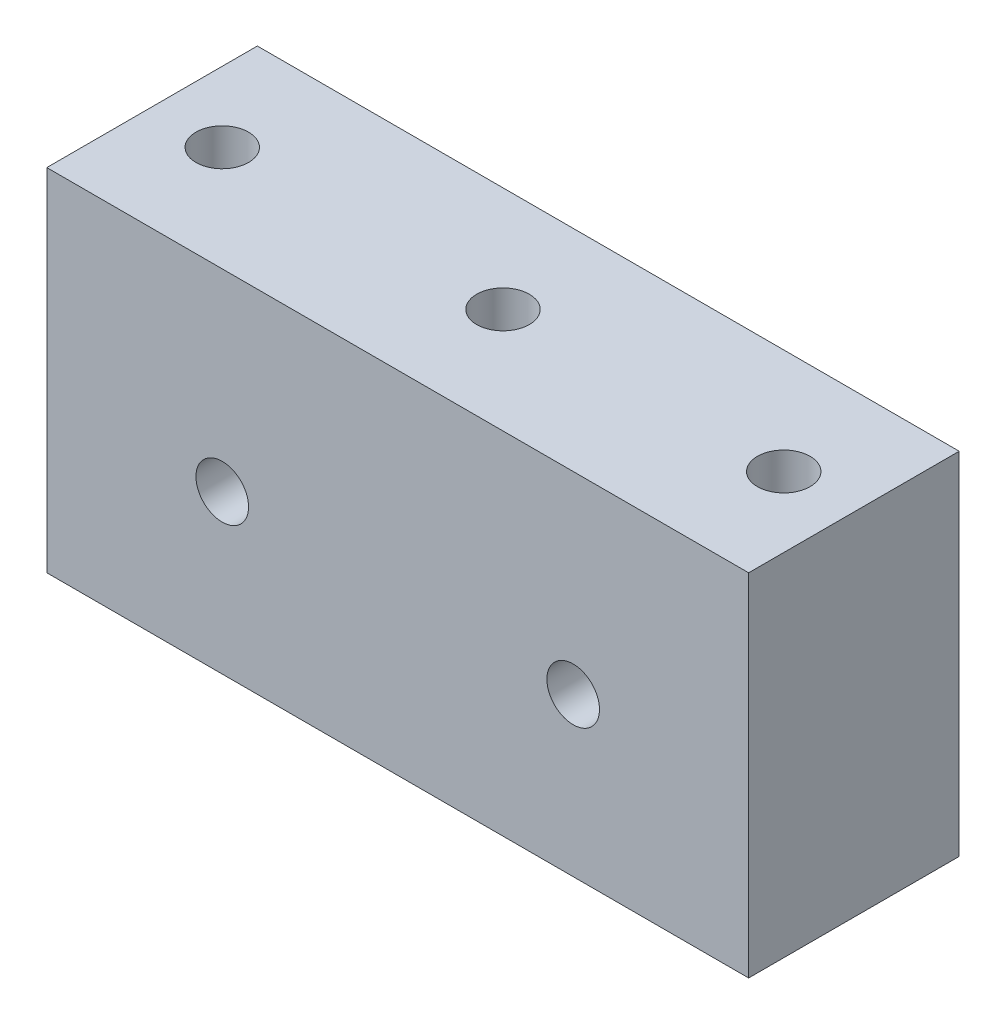
ISO-10303-21;
HEADER;
FILE_DESCRIPTION(('STEP AP214'),'2;1');
FILE_NAME('part.step','',(''),(''),'','','');
FILE_SCHEMA(('AUTOMOTIVE_DESIGN { 1 0 10303 214 1 1 1 1 }'));
ENDSEC;
DATA;
#1=APPLICATION_CONTEXT('core data for automotive mechanical design processes');
#2=APPLICATION_PROTOCOL_DEFINITION('international standard','automotive_design',2000,#1);
#3=PRODUCT_CONTEXT('',#1,'mechanical');
#4=PRODUCT('Part','Part','',(#3));
#5=PRODUCT_RELATED_PRODUCT_CATEGORY('part','',(#4));
#6=PRODUCT_DEFINITION_FORMATION('','',#4);
#7=PRODUCT_DEFINITION_CONTEXT('part definition',#1,'design');
#8=PRODUCT_DEFINITION('design','',#6,#7);
#9=PRODUCT_DEFINITION_SHAPE('','',#8);
#10=(LENGTH_UNIT() NAMED_UNIT(*) SI_UNIT(.MILLI.,.METRE.));
#11=(NAMED_UNIT(*) PLANE_ANGLE_UNIT() SI_UNIT($,.RADIAN.));
#12=(NAMED_UNIT(*) SI_UNIT($,.STERADIAN.) SOLID_ANGLE_UNIT());
#13=UNCERTAINTY_MEASURE_WITH_UNIT(LENGTH_MEASURE(1.E-05),#10,'distance_accuracy_value','');
#14=(GEOMETRIC_REPRESENTATION_CONTEXT(3) GLOBAL_UNCERTAINTY_ASSIGNED_CONTEXT((#13)) GLOBAL_UNIT_ASSIGNED_CONTEXT((#10,
#11,#12)) REPRESENTATION_CONTEXT('',''));
#15=CARTESIAN_POINT('',(0.,0.,0.));
#16=DIRECTION('',(0.,0.,1.));
#17=DIRECTION('',(1.,0.,0.));
#18=AXIS2_PLACEMENT_3D('',#15,#16,#17);
#19=CARTESIAN_POINT('',(0.,20.,0.));
#20=DIRECTION('',(0.,1.,0.));
#21=DIRECTION('',(0.,0.,1.));
#22=AXIS2_PLACEMENT_3D('',#19,#20,#21);
#23=PLANE('',#22);
#24=CARTESIAN_POINT('',(-16.,20.,0.));
#25=DIRECTION('',(0.,1.,0.));
#26=DIRECTION('',(0.,0.,1.));
#27=AXIS2_PLACEMENT_3D('',#24,#25,#26);
#28=CIRCLE('',#27,1.5);
#29=CARTESIAN_POINT('',(-16.,20.,1.5));
#30=VERTEX_POINT('',#29);
#31=EDGE_CURVE('E135',#30,#30,#28,.T.);
#32=ORIENTED_EDGE('',*,*,#31,.F.);
#33=EDGE_LOOP('',(#32));
#34=FACE_BOUND('',#33,.T.);
#35=DIRECTION('',(0.,0.,-1.));
#36=VECTOR('',#35,1.);
#37=CARTESIAN_POINT('',(20.,20.,-6.));
#38=LINE('',#37,#36);
#39=CARTESIAN_POINT('',(20.,20.,6.));
#40=VERTEX_POINT('',#39);
#41=CARTESIAN_POINT('',(20.,20.,-6.));
#42=VERTEX_POINT('',#41);
#43=EDGE_CURVE('E93',#40,#42,#38,.T.);
#44=ORIENTED_EDGE('',*,*,#43,.T.);
#45=DIRECTION('',(-1.,0.,0.));
#46=VECTOR('',#45,1.);
#47=CARTESIAN_POINT('',(-20.,20.,-6.));
#48=LINE('',#47,#46);
#49=CARTESIAN_POINT('',(-20.,20.,-6.));
#50=VERTEX_POINT('',#49);
#51=EDGE_CURVE('E88',#42,#50,#48,.T.);
#52=ORIENTED_EDGE('',*,*,#51,.T.);
#53=DIRECTION('',(0.,0.,1.));
#54=VECTOR('',#53,1.);
#55=CARTESIAN_POINT('',(-20.,20.,-6.));
#56=LINE('',#55,#54);
#57=CARTESIAN_POINT('',(-20.,20.,6.));
#58=VERTEX_POINT('',#57);
#59=EDGE_CURVE('E91',#50,#58,#56,.T.);
#60=ORIENTED_EDGE('',*,*,#59,.T.);
#61=DIRECTION('',(1.,0.,0.));
#62=VECTOR('',#61,1.);
#63=CARTESIAN_POINT('',(-20.,20.,6.));
#64=LINE('',#63,#62);
#65=EDGE_CURVE('E58',#58,#40,#64,.T.);
#66=ORIENTED_EDGE('',*,*,#65,.T.);
#67=EDGE_LOOP('',(#44,#52,#60,#66));
#68=FACE_BOUND('',#67,.T.);
#69=CARTESIAN_POINT('',(0.,20.,0.));
#70=DIRECTION('',(0.,1.,0.));
#71=DIRECTION('',(0.,0.,1.));
#72=AXIS2_PLACEMENT_3D('',#69,#70,#71);
#73=CIRCLE('',#72,1.5);
#74=CARTESIAN_POINT('',(0.,20.,1.5));
#75=VERTEX_POINT('',#74);
#76=EDGE_CURVE('E109',#75,#75,#73,.T.);
#77=ORIENTED_EDGE('',*,*,#76,.F.);
#78=EDGE_LOOP('',(#77));
#79=FACE_BOUND('',#78,.T.);
#80=CARTESIAN_POINT('',(16.,20.,0.));
#81=DIRECTION('',(0.,1.,0.));
#82=DIRECTION('',(0.,0.,-1.));
#83=AXIS2_PLACEMENT_3D('',#80,#81,#82);
#84=CIRCLE('',#83,1.5);
#85=CARTESIAN_POINT('',(16.,20.,-1.5));
#86=VERTEX_POINT('',#85);
#87=EDGE_CURVE('E129',#86,#86,#84,.T.);
#88=ORIENTED_EDGE('',*,*,#87,.F.);
#89=EDGE_LOOP('',(#88));
#90=FACE_BOUND('',#89,.T.);
#91=ADVANCED_FACE('F39',(#34,#68,#79,#90),#23,.T.);
#92=CARTESIAN_POINT('',(0.,0.,0.));
#93=DIRECTION('',(0.,1.,0.));
#94=DIRECTION('',(0.,0.,1.));
#95=AXIS2_PLACEMENT_3D('',#92,#93,#94);
#96=PLANE('',#95);
#97=DIRECTION('',(0.,0.,-1.));
#98=VECTOR('',#97,1.);
#99=CARTESIAN_POINT('',(20.,0.,-6.));
#100=LINE('',#99,#98);
#101=CARTESIAN_POINT('',(20.,0.,6.));
#102=VERTEX_POINT('',#101);
#103=CARTESIAN_POINT('',(20.,0.,-6.));
#104=VERTEX_POINT('',#103);
#105=EDGE_CURVE('E106',#102,#104,#100,.T.);
#106=ORIENTED_EDGE('',*,*,#105,.F.);
#107=DIRECTION('',(1.,0.,0.));
#108=VECTOR('',#107,1.);
#109=CARTESIAN_POINT('',(-20.,0.,6.));
#110=LINE('',#109,#108);
#111=CARTESIAN_POINT('',(-20.,0.,6.));
#112=VERTEX_POINT('',#111);
#113=EDGE_CURVE('E81',#112,#102,#110,.T.);
#114=ORIENTED_EDGE('',*,*,#113,.F.);
#115=DIRECTION('',(0.,0.,1.));
#116=VECTOR('',#115,1.);
#117=CARTESIAN_POINT('',(-20.,0.,-6.));
#118=LINE('',#117,#116);
#119=CARTESIAN_POINT('',(-20.,0.,-6.));
#120=VERTEX_POINT('',#119);
#121=EDGE_CURVE('E75',#120,#112,#118,.T.);
#122=ORIENTED_EDGE('',*,*,#121,.F.);
#123=DIRECTION('',(-1.,0.,0.));
#124=VECTOR('',#123,1.);
#125=CARTESIAN_POINT('',(-20.,0.,-6.));
#126=LINE('',#125,#124);
#127=EDGE_CURVE('E97',#104,#120,#126,.T.);
#128=ORIENTED_EDGE('',*,*,#127,.F.);
#129=EDGE_LOOP('',(#106,#114,#122,#128));
#130=FACE_BOUND('',#129,.T.);
#131=CARTESIAN_POINT('',(0.,0.,0.));
#132=DIRECTION('',(0.,1.,0.));
#133=DIRECTION('',(0.,0.,1.));
#134=AXIS2_PLACEMENT_3D('',#131,#132,#133);
#135=CIRCLE('',#134,1.5);
#136=CARTESIAN_POINT('',(0.,0.,1.5));
#137=VERTEX_POINT('',#136);
#138=EDGE_CURVE('E138',#137,#137,#135,.T.);
#139=ORIENTED_EDGE('',*,*,#138,.T.);
#140=EDGE_LOOP('',(#139));
#141=FACE_BOUND('',#140,.T.);
#142=CARTESIAN_POINT('',(-16.,0.,0.));
#143=DIRECTION('',(0.,1.,0.));
#144=DIRECTION('',(0.,0.,1.));
#145=AXIS2_PLACEMENT_3D('',#142,#143,#144);
#146=CIRCLE('',#145,1.5);
#147=CARTESIAN_POINT('',(-16.,0.,1.5));
#148=VERTEX_POINT('',#147);
#149=EDGE_CURVE('E132',#148,#148,#146,.T.);
#150=ORIENTED_EDGE('',*,*,#149,.T.);
#151=EDGE_LOOP('',(#150));
#152=FACE_BOUND('',#151,.T.);
#153=CARTESIAN_POINT('',(16.,0.,0.));
#154=DIRECTION('',(0.,1.,0.));
#155=DIRECTION('',(0.,0.,-1.));
#156=AXIS2_PLACEMENT_3D('',#153,#154,#155);
#157=CIRCLE('',#156,1.5);
#158=CARTESIAN_POINT('',(16.,0.,-1.5));
#159=VERTEX_POINT('',#158);
#160=EDGE_CURVE('E120',#159,#159,#157,.T.);
#161=ORIENTED_EDGE('',*,*,#160,.T.);
#162=EDGE_LOOP('',(#161));
#163=FACE_BOUND('',#162,.T.);
#164=ADVANCED_FACE('F146',(#130,#141,#152,#163),#96,.F.);
#165=CARTESIAN_POINT('',(20.,20.,-6.));
#166=DIRECTION('',(-1.,0.,0.));
#167=DIRECTION('',(0.,0.,1.));
#168=AXIS2_PLACEMENT_3D('',#165,#166,#167);
#169=PLANE('',#168);
#170=ORIENTED_EDGE('',*,*,#105,.T.);
#171=DIRECTION('',(0.,-1.,0.));
#172=VECTOR('',#171,1.);
#173=CARTESIAN_POINT('',(20.,20.,-6.));
#174=LINE('',#173,#172);
#175=EDGE_CURVE('E11',#42,#104,#174,.T.);
#176=ORIENTED_EDGE('',*,*,#175,.F.);
#177=ORIENTED_EDGE('',*,*,#43,.F.);
#178=DIRECTION('',(0.,-1.,0.));
#179=VECTOR('',#178,1.);
#180=CARTESIAN_POINT('',(20.,20.,6.));
#181=LINE('',#180,#179);
#182=EDGE_CURVE('E102',#40,#102,#181,.T.);
#183=ORIENTED_EDGE('',*,*,#182,.T.);
#184=EDGE_LOOP('',(#170,#176,#177,#183));
#185=FACE_BOUND('',#184,.T.);
#186=ADVANCED_FACE('F41',(#185),#169,.F.);
#187=CARTESIAN_POINT('',(-20.,20.,-6.));
#188=DIRECTION('',(0.,0.,1.));
#189=DIRECTION('',(1.,0.,0.));
#190=AXIS2_PLACEMENT_3D('',#187,#188,#189);
#191=PLANE('',#190);
#192=CARTESIAN_POINT('',(-10.,9.,-6.));
#193=DIRECTION('',(0.,0.,-1.));
#194=DIRECTION('',(-1.,0.,0.));
#195=AXIS2_PLACEMENT_3D('',#192,#193,#194);
#196=CIRCLE('',#195,1.5);
#197=CARTESIAN_POINT('',(-11.5,9.,-6.));
#198=VERTEX_POINT('',#197);
#199=EDGE_CURVE('E116',#198,#198,#196,.T.);
#200=ORIENTED_EDGE('',*,*,#199,.F.);
#201=EDGE_LOOP('',(#200));
#202=FACE_BOUND('',#201,.T.);
#203=CARTESIAN_POINT('',(10.,9.,-6.));
#204=DIRECTION('',(0.,0.,-1.));
#205=DIRECTION('',(1.,0.,0.));
#206=AXIS2_PLACEMENT_3D('',#203,#204,#205);
#207=CIRCLE('',#206,1.5);
#208=CARTESIAN_POINT('',(11.5,9.,-6.));
#209=VERTEX_POINT('',#208);
#210=EDGE_CURVE('E122',#209,#209,#207,.T.);
#211=ORIENTED_EDGE('',*,*,#210,.F.);
#212=EDGE_LOOP('',(#211));
#213=FACE_BOUND('',#212,.T.);
#214=ORIENTED_EDGE('',*,*,#127,.T.);
#215=DIRECTION('',(0.,-1.,0.));
#216=VECTOR('',#215,1.);
#217=CARTESIAN_POINT('',(-20.,20.,-6.));
#218=LINE('',#217,#216);
#219=EDGE_CURVE('E49',#50,#120,#218,.T.);
#220=ORIENTED_EDGE('',*,*,#219,.F.);
#221=ORIENTED_EDGE('',*,*,#51,.F.);
#222=ORIENTED_EDGE('',*,*,#175,.T.);
#223=EDGE_LOOP('',(#214,#220,#221,#222));
#224=FACE_BOUND('',#223,.T.);
#225=ADVANCED_FACE('F96',(#202,#213,#224),#191,.F.);
#226=CARTESIAN_POINT('',(-20.,20.,-6.));
#227=DIRECTION('',(1.,0.,0.));
#228=DIRECTION('',(0.,0.,-1.));
#229=AXIS2_PLACEMENT_3D('',#226,#227,#228);
#230=PLANE('',#229);
#231=ORIENTED_EDGE('',*,*,#121,.T.);
#232=DIRECTION('',(0.,-1.,0.));
#233=VECTOR('',#232,1.);
#234=CARTESIAN_POINT('',(-20.,20.,6.));
#235=LINE('',#234,#233);
#236=EDGE_CURVE('E98',#58,#112,#235,.T.);
#237=ORIENTED_EDGE('',*,*,#236,.F.);
#238=ORIENTED_EDGE('',*,*,#59,.F.);
#239=ORIENTED_EDGE('',*,*,#219,.T.);
#240=EDGE_LOOP('',(#231,#237,#238,#239));
#241=FACE_BOUND('',#240,.T.);
#242=ADVANCED_FACE('F100',(#241),#230,.F.);
#243=CARTESIAN_POINT('',(-20.,20.,6.));
#244=DIRECTION('',(0.,0.,-1.));
#245=DIRECTION('',(-1.,0.,0.));
#246=AXIS2_PLACEMENT_3D('',#243,#244,#245);
#247=PLANE('',#246);
#248=CARTESIAN_POINT('',(-10.,9.,6.));
#249=DIRECTION('',(0.,0.,-1.));
#250=DIRECTION('',(-1.,0.,0.));
#251=AXIS2_PLACEMENT_3D('',#248,#249,#250);
#252=CIRCLE('',#251,1.5);
#253=CARTESIAN_POINT('',(-11.5,9.,6.));
#254=VERTEX_POINT('',#253);
#255=EDGE_CURVE('E43',#254,#254,#252,.T.);
#256=ORIENTED_EDGE('',*,*,#255,.T.);
#257=EDGE_LOOP('',(#256));
#258=FACE_BOUND('',#257,.T.);
#259=CARTESIAN_POINT('',(10.,9.,6.));
#260=DIRECTION('',(0.,0.,-1.));
#261=DIRECTION('',(-1.,0.,0.));
#262=AXIS2_PLACEMENT_3D('',#259,#260,#261);
#263=CIRCLE('',#262,1.5);
#264=CARTESIAN_POINT('',(8.5,9.,6.));
#265=VERTEX_POINT('',#264);
#266=EDGE_CURVE('E114',#265,#265,#263,.T.);
#267=ORIENTED_EDGE('',*,*,#266,.T.);
#268=EDGE_LOOP('',(#267));
#269=FACE_BOUND('',#268,.T.);
#270=ORIENTED_EDGE('',*,*,#113,.T.);
#271=ORIENTED_EDGE('',*,*,#182,.F.);
#272=ORIENTED_EDGE('',*,*,#65,.F.);
#273=ORIENTED_EDGE('',*,*,#236,.T.);
#274=EDGE_LOOP('',(#270,#271,#272,#273));
#275=FACE_BOUND('',#274,.T.);
#276=ADVANCED_FACE('F152',(#258,#269,#275),#247,.F.);
#277=CARTESIAN_POINT('',(0.,20.,0.));
#278=DIRECTION('',(0.,-1.,0.));
#279=DIRECTION('',(0.,0.,-1.));
#280=AXIS2_PLACEMENT_3D('',#277,#278,#279);
#281=CYLINDRICAL_SURFACE('',#280,1.5);
#282=ORIENTED_EDGE('',*,*,#76,.T.);
#283=EDGE_LOOP('',(#282));
#284=FACE_BOUND('',#283,.T.);
#285=ORIENTED_EDGE('',*,*,#138,.F.);
#286=EDGE_LOOP('',(#285));
#287=FACE_BOUND('',#286,.T.);
#288=ADVANCED_FACE('F149',(#284,#287),#281,.F.);
#289=CARTESIAN_POINT('',(-16.,20.,0.));
#290=DIRECTION('',(0.,-1.,0.));
#291=DIRECTION('',(0.,0.,-1.));
#292=AXIS2_PLACEMENT_3D('',#289,#290,#291);
#293=CYLINDRICAL_SURFACE('',#292,1.5);
#294=ORIENTED_EDGE('',*,*,#31,.T.);
#295=EDGE_LOOP('',(#294));
#296=FACE_BOUND('',#295,.T.);
#297=ORIENTED_EDGE('',*,*,#149,.F.);
#298=EDGE_LOOP('',(#297));
#299=FACE_BOUND('',#298,.T.);
#300=ADVANCED_FACE('F151',(#296,#299),#293,.F.);
#301=CARTESIAN_POINT('',(16.,20.,0.));
#302=DIRECTION('',(0.,-1.,0.));
#303=DIRECTION('',(0.,0.,-1.));
#304=AXIS2_PLACEMENT_3D('',#301,#302,#303);
#305=CYLINDRICAL_SURFACE('',#304,1.5);
#306=ORIENTED_EDGE('',*,*,#87,.T.);
#307=EDGE_LOOP('',(#306));
#308=FACE_BOUND('',#307,.T.);
#309=ORIENTED_EDGE('',*,*,#160,.F.);
#310=EDGE_LOOP('',(#309));
#311=FACE_BOUND('',#310,.T.);
#312=ADVANCED_FACE('F159',(#308,#311),#305,.F.);
#313=CARTESIAN_POINT('',(10.,9.,14.));
#314=DIRECTION('',(0.,0.,-1.));
#315=DIRECTION('',(-1.,0.,0.));
#316=AXIS2_PLACEMENT_3D('',#313,#314,#315);
#317=CYLINDRICAL_SURFACE('',#316,1.5);
#318=ORIENTED_EDGE('',*,*,#210,.T.);
#319=EDGE_LOOP('',(#318));
#320=FACE_BOUND('',#319,.T.);
#321=ORIENTED_EDGE('',*,*,#266,.F.);
#322=EDGE_LOOP('',(#321));
#323=FACE_BOUND('',#322,.T.);
#324=ADVANCED_FACE('F184',(#320,#323),#317,.F.);
#325=CARTESIAN_POINT('',(-10.,9.,14.));
#326=DIRECTION('',(0.,0.,-1.));
#327=DIRECTION('',(-1.,0.,0.));
#328=AXIS2_PLACEMENT_3D('',#325,#326,#327);
#329=CYLINDRICAL_SURFACE('',#328,1.5);
#330=ORIENTED_EDGE('',*,*,#199,.T.);
#331=EDGE_LOOP('',(#330));
#332=FACE_BOUND('',#331,.T.);
#333=ORIENTED_EDGE('',*,*,#255,.F.);
#334=EDGE_LOOP('',(#333));
#335=FACE_BOUND('',#334,.T.);
#336=ADVANCED_FACE('F187',(#332,#335),#329,.F.);
#337=CLOSED_SHELL('',(#91,#164,#186,#225,#242,#276,#288,#300,#312,#324,#336));
#338=MANIFOLD_SOLID_BREP('B2',#337);
#339=ADVANCED_BREP_SHAPE_REPRESENTATION('',(#18,#338),#14);
#340=SHAPE_DEFINITION_REPRESENTATION(#9,#339);
ENDSEC;
END-ISO-10303-21;
